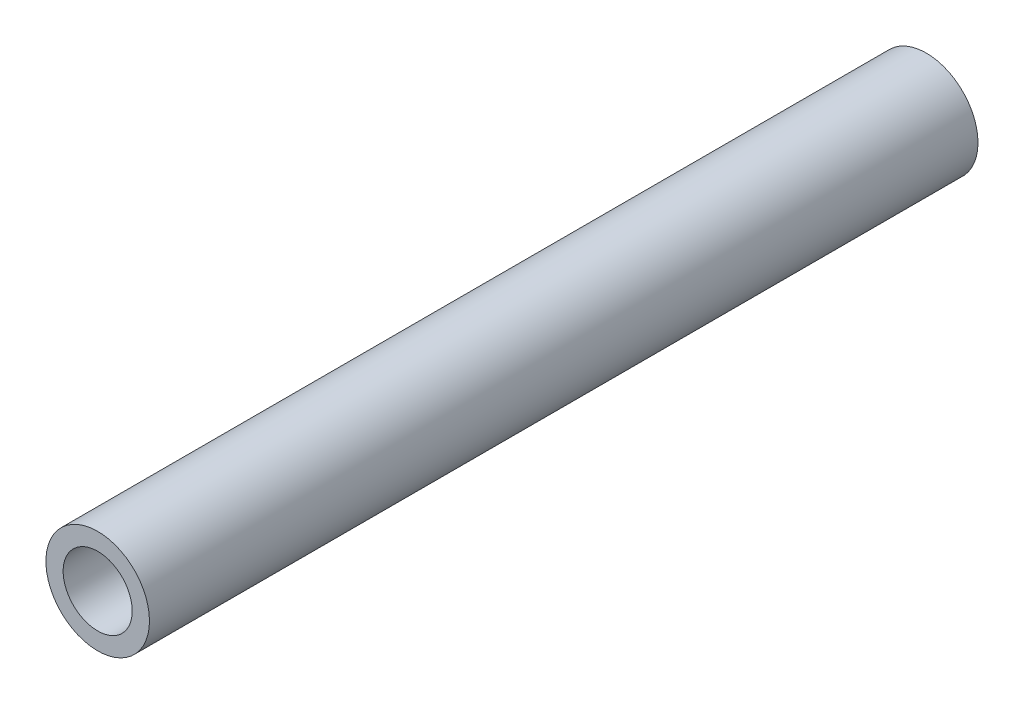
ISO-10303-21;
HEADER;
FILE_DESCRIPTION(('STEP AP214'),'2;1');
FILE_NAME('part.step','',(''),(''),'','','');
FILE_SCHEMA(('AUTOMOTIVE_DESIGN { 1 0 10303 214 1 1 1 1 }'));
ENDSEC;
DATA;
#1=APPLICATION_CONTEXT('core data for automotive mechanical design processes');
#2=APPLICATION_PROTOCOL_DEFINITION('international standard','automotive_design',2000,#1);
#3=PRODUCT_CONTEXT('',#1,'mechanical');
#4=PRODUCT('Part','Part','',(#3));
#5=PRODUCT_RELATED_PRODUCT_CATEGORY('part','',(#4));
#6=PRODUCT_DEFINITION_FORMATION('','',#4);
#7=PRODUCT_DEFINITION_CONTEXT('part definition',#1,'design');
#8=PRODUCT_DEFINITION('design','',#6,#7);
#9=PRODUCT_DEFINITION_SHAPE('','',#8);
#10=(LENGTH_UNIT() NAMED_UNIT(*) SI_UNIT(.MILLI.,.METRE.));
#11=(NAMED_UNIT(*) PLANE_ANGLE_UNIT() SI_UNIT($,.RADIAN.));
#12=(NAMED_UNIT(*) SI_UNIT($,.STERADIAN.) SOLID_ANGLE_UNIT());
#13=UNCERTAINTY_MEASURE_WITH_UNIT(LENGTH_MEASURE(1.E-05),#10,'distance_accuracy_value','');
#14=(GEOMETRIC_REPRESENTATION_CONTEXT(3) GLOBAL_UNCERTAINTY_ASSIGNED_CONTEXT((#13)) GLOBAL_UNIT_ASSIGNED_CONTEXT((#10,
#11,#12)) REPRESENTATION_CONTEXT('',''));
#15=CARTESIAN_POINT('',(0.,0.,0.));
#16=DIRECTION('',(0.,0.,1.));
#17=DIRECTION('',(1.,0.,0.));
#18=AXIS2_PLACEMENT_3D('',#15,#16,#17);
#19=CARTESIAN_POINT('',(0.,0.,120.));
#20=DIRECTION('',(0.,0.,1.));
#21=DIRECTION('',(1.,0.,0.));
#22=AXIS2_PLACEMENT_3D('',#19,#20,#21);
#23=PLANE('',#22);
#24=CARTESIAN_POINT('',(0.,0.,120.));
#25=DIRECTION('',(0.,0.,1.));
#26=DIRECTION('',(1.,0.,0.));
#27=AXIS2_PLACEMENT_3D('',#24,#25,#26);
#28=CIRCLE('',#27,7.5);
#29=CARTESIAN_POINT('',(7.5,0.,120.));
#30=VERTEX_POINT('',#29);
#31=EDGE_CURVE('E10',#30,#30,#28,.T.);
#32=ORIENTED_EDGE('',*,*,#31,.T.);
#33=EDGE_LOOP('',(#32));
#34=FACE_BOUND('',#33,.T.);
#35=CARTESIAN_POINT('',(0.,0.,120.));
#36=DIRECTION('',(0.,0.,1.));
#37=DIRECTION('',(1.,0.,0.));
#38=AXIS2_PLACEMENT_3D('',#35,#36,#37);
#39=CIRCLE('',#38,5.);
#40=CARTESIAN_POINT('',(5.,0.,120.));
#41=VERTEX_POINT('',#40);
#42=EDGE_CURVE('E50',#41,#41,#39,.T.);
#43=ORIENTED_EDGE('',*,*,#42,.F.);
#44=EDGE_LOOP('',(#43));
#45=FACE_BOUND('',#44,.T.);
#46=ADVANCED_FACE('F37',(#34,#45),#23,.T.);
#47=CARTESIAN_POINT('',(0.,0.,0.));
#48=DIRECTION('',(0.,0.,1.));
#49=DIRECTION('',(1.,0.,0.));
#50=AXIS2_PLACEMENT_3D('',#47,#48,#49);
#51=PLANE('',#50);
#52=CARTESIAN_POINT('',(0.,0.,0.));
#53=DIRECTION('',(0.,0.,1.));
#54=DIRECTION('',(1.,0.,0.));
#55=AXIS2_PLACEMENT_3D('',#52,#53,#54);
#56=CIRCLE('',#55,7.5);
#57=CARTESIAN_POINT('',(7.5,0.,0.));
#58=VERTEX_POINT('',#57);
#59=EDGE_CURVE('E41',#58,#58,#56,.T.);
#60=ORIENTED_EDGE('',*,*,#59,.F.);
#61=EDGE_LOOP('',(#60));
#62=FACE_BOUND('',#61,.T.);
#63=CARTESIAN_POINT('',(0.,0.,0.));
#64=DIRECTION('',(0.,0.,1.));
#65=DIRECTION('',(1.,0.,0.));
#66=AXIS2_PLACEMENT_3D('',#63,#64,#65);
#67=CIRCLE('',#66,5.);
#68=CARTESIAN_POINT('',(5.,0.,0.));
#69=VERTEX_POINT('',#68);
#70=EDGE_CURVE('E52',#69,#69,#67,.T.);
#71=ORIENTED_EDGE('',*,*,#70,.T.);
#72=EDGE_LOOP('',(#71));
#73=FACE_BOUND('',#72,.T.);
#74=ADVANCED_FACE('F64',(#62,#73),#51,.F.);
#75=CARTESIAN_POINT('',(0.,0.,120.));
#76=DIRECTION('',(0.,0.,-1.));
#77=DIRECTION('',(-1.,0.,0.));
#78=AXIS2_PLACEMENT_3D('',#75,#76,#77);
#79=CYLINDRICAL_SURFACE('',#78,7.5);
#80=ORIENTED_EDGE('',*,*,#31,.F.);
#81=EDGE_LOOP('',(#80));
#82=FACE_BOUND('',#81,.T.);
#83=ORIENTED_EDGE('',*,*,#59,.T.);
#84=EDGE_LOOP('',(#83));
#85=FACE_BOUND('',#84,.T.);
#86=ADVANCED_FACE('F39',(#82,#85),#79,.T.);
#87=CARTESIAN_POINT('',(0.,0.,120.));
#88=DIRECTION('',(0.,0.,-1.));
#89=DIRECTION('',(-1.,0.,0.));
#90=AXIS2_PLACEMENT_3D('',#87,#88,#89);
#91=CYLINDRICAL_SURFACE('',#90,5.);
#92=ORIENTED_EDGE('',*,*,#42,.T.);
#93=EDGE_LOOP('',(#92));
#94=FACE_BOUND('',#93,.T.);
#95=ORIENTED_EDGE('',*,*,#70,.F.);
#96=EDGE_LOOP('',(#95));
#97=FACE_BOUND('',#96,.T.);
#98=ADVANCED_FACE('F60',(#94,#97),#91,.F.);
#99=CLOSED_SHELL('',(#46,#74,#86,#98));
#100=MANIFOLD_SOLID_BREP('B2',#99);
#101=ADVANCED_BREP_SHAPE_REPRESENTATION('',(#18,#100),#14);
#102=SHAPE_DEFINITION_REPRESENTATION(#9,#101);
ENDSEC;
END-ISO-10303-21;
